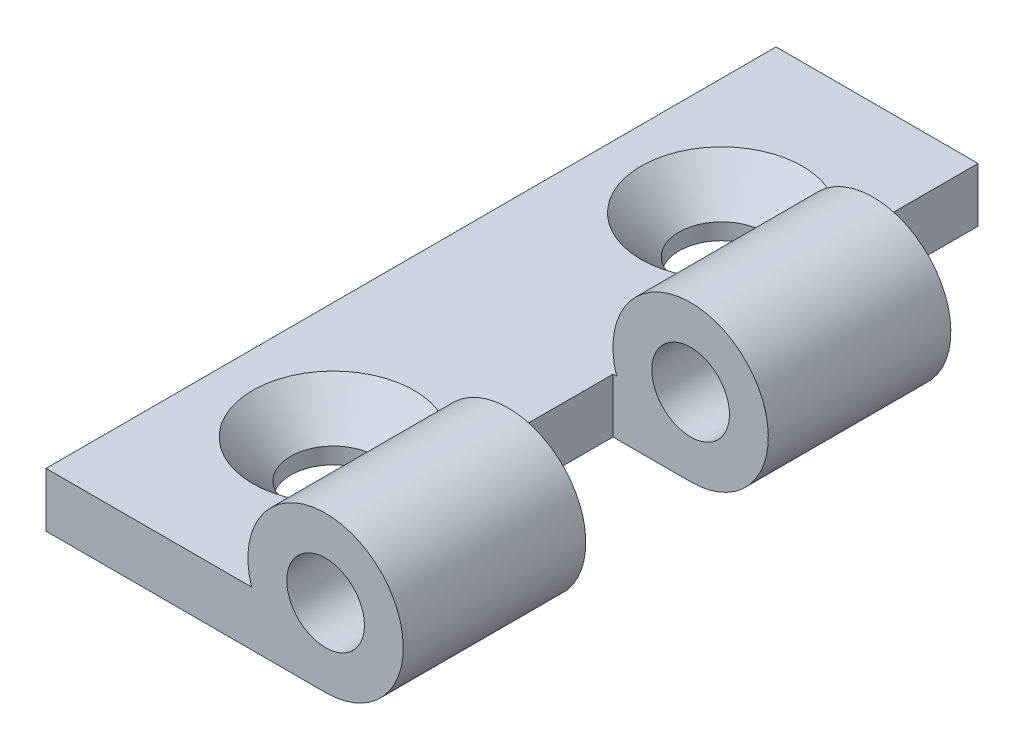
ISO-10303-21;
HEADER;
FILE_DESCRIPTION(('STEP AP214'),'2;1');
FILE_NAME('part.step','',(''),(''),'','','');
FILE_SCHEMA(('AUTOMOTIVE_DESIGN { 1 0 10303 214 1 1 1 1 }'));
ENDSEC;
DATA;
#1=APPLICATION_CONTEXT('core data for automotive mechanical design processes');
#2=APPLICATION_PROTOCOL_DEFINITION('international standard','automotive_design',2000,#1);
#3=PRODUCT_CONTEXT('',#1,'mechanical');
#4=PRODUCT('Part','Part','',(#3));
#5=PRODUCT_RELATED_PRODUCT_CATEGORY('part','',(#4));
#6=PRODUCT_DEFINITION_FORMATION('','',#4);
#7=PRODUCT_DEFINITION_CONTEXT('part definition',#1,'design');
#8=PRODUCT_DEFINITION('design','',#6,#7);
#9=PRODUCT_DEFINITION_SHAPE('','',#8);
#10=(LENGTH_UNIT() NAMED_UNIT(*) SI_UNIT(.MILLI.,.METRE.));
#11=(NAMED_UNIT(*) PLANE_ANGLE_UNIT() SI_UNIT($,.RADIAN.));
#12=(NAMED_UNIT(*) SI_UNIT($,.STERADIAN.) SOLID_ANGLE_UNIT());
#13=UNCERTAINTY_MEASURE_WITH_UNIT(LENGTH_MEASURE(1.E-05),#10,'distance_accuracy_value','');
#14=(GEOMETRIC_REPRESENTATION_CONTEXT(3) GLOBAL_UNCERTAINTY_ASSIGNED_CONTEXT((#13)) GLOBAL_UNIT_ASSIGNED_CONTEXT((#10,
#11,#12)) REPRESENTATION_CONTEXT('',''));
#15=CARTESIAN_POINT('',(0.,0.,0.));
#16=DIRECTION('',(0.,0.,1.));
#17=DIRECTION('',(1.,0.,0.));
#18=AXIS2_PLACEMENT_3D('',#15,#16,#17);
#19=CARTESIAN_POINT('',(0.,-5.,23.5));
#20=DIRECTION('',(0.,-1.,0.));
#21=DIRECTION('',(1.,0.,0.));
#22=AXIS2_PLACEMENT_3D('',#19,#20,#21);
#23=PLANE('',#22);
#24=CARTESIAN_POINT('',(-10.5,-5.,-12.5));
#25=DIRECTION('',(0.,1.,0.));
#26=DIRECTION('',(0.,0.,1.));
#27=AXIS2_PLACEMENT_3D('',#24,#25,#26);
#28=CIRCLE('',#27,2.75);
#29=CARTESIAN_POINT('',(-10.5,-5.,-9.75));
#30=VERTEX_POINT('',#29);
#31=EDGE_CURVE('E216',#30,#30,#28,.T.);
#32=ORIENTED_EDGE('',*,*,#31,.T.);
#33=EDGE_LOOP('',(#32));
#34=FACE_BOUND('',#33,.T.);
#35=CARTESIAN_POINT('',(-10.5,-5.,12.5));
#36=DIRECTION('',(0.,1.,0.));
#37=DIRECTION('',(0.,0.,1.));
#38=AXIS2_PLACEMENT_3D('',#35,#36,#37);
#39=CIRCLE('',#38,2.75);
#40=CARTESIAN_POINT('',(-10.5,-5.,15.25));
#41=VERTEX_POINT('',#40);
#42=EDGE_CURVE('E141',#41,#41,#39,.T.);
#43=ORIENTED_EDGE('',*,*,#42,.T.);
#44=EDGE_LOOP('',(#43));
#45=FACE_BOUND('',#44,.T.);
#46=DIRECTION('',(0.,0.,1.));
#47=VECTOR('',#46,1.);
#48=CARTESIAN_POINT('',(-5.,-5.,-23.5));
#49=LINE('',#48,#47);
#50=CARTESIAN_POINT('',(-5.,-5.,-23.5));
#51=VERTEX_POINT('',#50);
#52=CARTESIAN_POINT('',(-5.,-5.,-11.75));
#53=VERTEX_POINT('',#52);
#54=EDGE_CURVE('E120',#51,#53,#49,.T.);
#55=ORIENTED_EDGE('',*,*,#54,.T.);
#56=DIRECTION('',(1.,0.,0.));
#57=VECTOR('',#56,1.);
#58=CARTESIAN_POINT('',(5.,-5.,-11.75));
#59=LINE('',#58,#57);
#60=CARTESIAN_POINT('',(0.,-5.,-11.75));
#61=VERTEX_POINT('',#60);
#62=EDGE_CURVE('E127',#53,#61,#59,.T.);
#63=ORIENTED_EDGE('',*,*,#62,.T.);
#64=DIRECTION('',(0.,0.,-1.));
#65=VECTOR('',#64,1.);
#66=CARTESIAN_POINT('',(0.,-5.,23.5));
#67=LINE('',#66,#65);
#68=CARTESIAN_POINT('',(0.,-5.,0.));
#69=VERTEX_POINT('',#68);
#70=EDGE_CURVE('E168',#69,#61,#67,.T.);
#71=ORIENTED_EDGE('',*,*,#70,.F.);
#72=DIRECTION('',(-1.,0.,0.));
#73=VECTOR('',#72,1.);
#74=CARTESIAN_POINT('',(5.,-5.,0.));
#75=LINE('',#74,#73);
#76=CARTESIAN_POINT('',(-5.,-5.,0.));
#77=VERTEX_POINT('',#76);
#78=EDGE_CURVE('E130',#69,#77,#75,.T.);
#79=ORIENTED_EDGE('',*,*,#78,.T.);
#80=DIRECTION('',(0.,0.,1.));
#81=VECTOR('',#80,1.);
#82=CARTESIAN_POINT('',(-5.,-5.,0.));
#83=LINE('',#82,#81);
#84=CARTESIAN_POINT('',(-5.,-5.,11.75));
#85=VERTEX_POINT('',#84);
#86=EDGE_CURVE('E321',#77,#85,#83,.T.);
#87=ORIENTED_EDGE('',*,*,#86,.T.);
#88=DIRECTION('',(1.,0.,0.));
#89=VECTOR('',#88,1.);
#90=CARTESIAN_POINT('',(5.,-5.,11.75));
#91=LINE('',#90,#89);
#92=CARTESIAN_POINT('',(0.,-5.,11.75));
#93=VERTEX_POINT('',#92);
#94=EDGE_CURVE('E316',#85,#93,#91,.T.);
#95=ORIENTED_EDGE('',*,*,#94,.T.);
#96=CARTESIAN_POINT('',(0.,-5.,23.5));
#97=VERTEX_POINT('',#96);
#98=EDGE_CURVE('E51',#97,#93,#67,.T.);
#99=ORIENTED_EDGE('',*,*,#98,.F.);
#100=DIRECTION('',(-1.,0.,0.));
#101=VECTOR('',#100,1.);
#102=CARTESIAN_POINT('',(0.,-5.,23.5));
#103=LINE('',#102,#101);
#104=CARTESIAN_POINT('',(-18.,-5.,23.5));
#105=VERTEX_POINT('',#104);
#106=EDGE_CURVE('E157',#97,#105,#103,.T.);
#107=ORIENTED_EDGE('',*,*,#106,.T.);
#108=DIRECTION('',(0.,0.,-1.));
#109=VECTOR('',#108,1.);
#110=CARTESIAN_POINT('',(-18.,-5.,23.5));
#111=LINE('',#110,#109);
#112=CARTESIAN_POINT('',(-18.,-5.,-23.5));
#113=VERTEX_POINT('',#112);
#114=EDGE_CURVE('E137',#105,#113,#111,.T.);
#115=ORIENTED_EDGE('',*,*,#114,.T.);
#116=DIRECTION('',(-1.,0.,0.));
#117=VECTOR('',#116,1.);
#118=CARTESIAN_POINT('',(0.,-5.,-23.5));
#119=LINE('',#118,#117);
#120=EDGE_CURVE('E134',#51,#113,#119,.T.);
#121=ORIENTED_EDGE('',*,*,#120,.F.);
#122=EDGE_LOOP('',(#55,#63,#71,#79,#87,#95,#99,#107,#115,#121));
#123=FACE_BOUND('',#122,.T.);
#124=ADVANCED_FACE('F43',(#34,#45,#123),#23,.T.);
#125=CARTESIAN_POINT('',(0.,0.,23.5));
#126=DIRECTION('',(0.,0.,-1.));
#127=DIRECTION('',(-1.,0.,0.));
#128=AXIS2_PLACEMENT_3D('',#125,#126,#127);
#129=CYLINDRICAL_SURFACE('',#128,5.);
#130=CARTESIAN_POINT('',(0.,0.,11.75));
#131=DIRECTION('',(0.,0.,1.));
#132=DIRECTION('',(1.,0.,0.));
#133=AXIS2_PLACEMENT_3D('',#130,#131,#132);
#134=CIRCLE('',#133,5.);
#135=CARTESIAN_POINT('',(-4.76969600708473,-1.5,11.75));
#136=VERTEX_POINT('',#135);
#137=EDGE_CURVE('E189',#93,#136,#134,.T.);
#138=ORIENTED_EDGE('',*,*,#137,.T.);
#139=DIRECTION('',(0.,0.,-1.));
#140=VECTOR('',#139,1.);
#141=CARTESIAN_POINT('',(-4.76969600708473,-1.5,23.5));
#142=LINE('',#141,#140);
#143=CARTESIAN_POINT('',(-4.76969600708473,-1.5,23.5));
#144=VERTEX_POINT('',#143);
#145=EDGE_CURVE('E167',#144,#136,#142,.T.);
#146=ORIENTED_EDGE('',*,*,#145,.F.);
#147=CARTESIAN_POINT('',(0.,0.,23.5));
#148=DIRECTION('',(0.,0.,1.));
#149=DIRECTION('',(1.,0.,0.));
#150=AXIS2_PLACEMENT_3D('',#147,#148,#149);
#151=CIRCLE('',#150,5.);
#152=EDGE_CURVE('E226',#97,#144,#151,.T.);
#153=ORIENTED_EDGE('',*,*,#152,.F.);
#154=ORIENTED_EDGE('',*,*,#98,.T.);
#155=EDGE_LOOP('',(#138,#146,#153,#154));
#156=FACE_BOUND('',#155,.T.);
#157=ADVANCED_FACE('F266',(#156),#129,.T.);
#158=CARTESIAN_POINT('',(0.,0.,23.5));
#159=DIRECTION('',(0.,0.,-1.));
#160=DIRECTION('',(-1.,0.,0.));
#161=AXIS2_PLACEMENT_3D('',#158,#159,#160);
#162=CYLINDRICAL_SURFACE('',#161,2.5);
#163=CARTESIAN_POINT('',(0.,0.,11.75));
#164=DIRECTION('',(0.,0.,1.));
#165=DIRECTION('',(1.,0.,0.));
#166=AXIS2_PLACEMENT_3D('',#163,#164,#165);
#167=CIRCLE('',#166,2.5);
#168=CARTESIAN_POINT('',(2.5,0.,11.75));
#169=VERTEX_POINT('',#168);
#170=EDGE_CURVE('E177',#169,#169,#167,.T.);
#171=ORIENTED_EDGE('',*,*,#170,.F.);
#172=EDGE_LOOP('',(#171));
#173=FACE_BOUND('',#172,.T.);
#174=CARTESIAN_POINT('',(0.,0.,23.5));
#175=DIRECTION('',(0.,0.,1.));
#176=DIRECTION('',(1.,0.,0.));
#177=AXIS2_PLACEMENT_3D('',#174,#175,#176);
#178=CIRCLE('',#177,2.5);
#179=CARTESIAN_POINT('',(2.5,0.,23.5));
#180=VERTEX_POINT('',#179);
#181=EDGE_CURVE('E152',#180,#180,#178,.T.);
#182=ORIENTED_EDGE('',*,*,#181,.T.);
#183=EDGE_LOOP('',(#182));
#184=FACE_BOUND('',#183,.T.);
#185=ADVANCED_FACE('F249',(#173,#184),#162,.F.);
#186=CARTESIAN_POINT('',(0.,0.,-23.5));
#187=DIRECTION('',(0.,0.,1.));
#188=DIRECTION('',(1.,0.,0.));
#189=AXIS2_PLACEMENT_3D('',#186,#187,#188);
#190=PLANE('',#189);
#191=DIRECTION('',(0.,1.,0.));
#192=VECTOR('',#191,1.);
#193=CARTESIAN_POINT('',(-5.,-5.,-23.5));
#194=LINE('',#193,#192);
#195=CARTESIAN_POINT('',(-5.,-1.5,-23.5));
#196=VERTEX_POINT('',#195);
#197=EDGE_CURVE('E69',#51,#196,#194,.T.);
#198=ORIENTED_EDGE('',*,*,#197,.F.);
#199=ORIENTED_EDGE('',*,*,#120,.T.);
#200=DIRECTION('',(0.,1.,0.));
#201=VECTOR('',#200,1.);
#202=CARTESIAN_POINT('',(-18.,0.,-23.5));
#203=LINE('',#202,#201);
#204=CARTESIAN_POINT('',(-18.,-1.5,-23.5));
#205=VERTEX_POINT('',#204);
#206=EDGE_CURVE('E146',#113,#205,#203,.T.);
#207=ORIENTED_EDGE('',*,*,#206,.T.);
#208=DIRECTION('',(1.,0.,0.));
#209=VECTOR('',#208,1.);
#210=CARTESIAN_POINT('',(0.,-1.5,-23.5));
#211=LINE('',#210,#209);
#212=EDGE_CURVE('E139',#205,#196,#211,.T.);
#213=ORIENTED_EDGE('',*,*,#212,.T.);
#214=EDGE_LOOP('',(#198,#199,#207,#213));
#215=FACE_BOUND('',#214,.T.);
#216=ADVANCED_FACE('F132',(#215),#190,.F.);
#217=CARTESIAN_POINT('',(0.,0.,-11.75));
#218=DIRECTION('',(0.,0.,1.));
#219=DIRECTION('',(1.,0.,0.));
#220=AXIS2_PLACEMENT_3D('',#217,#218,#219);
#221=CIRCLE('',#220,5.);
#222=CARTESIAN_POINT('',(-4.76969600708473,-1.5,-11.75));
#223=VERTEX_POINT('',#222);
#224=EDGE_CURVE('E192',#61,#223,#221,.T.);
#225=ORIENTED_EDGE('',*,*,#224,.T.);
#226=CARTESIAN_POINT('',(-4.76969600708473,-1.5,0.));
#227=VERTEX_POINT('',#226);
#228=EDGE_CURVE('E164',#227,#223,#142,.T.);
#229=ORIENTED_EDGE('',*,*,#228,.F.);
#230=CARTESIAN_POINT('',(0.,0.,0.));
#231=DIRECTION('',(0.,0.,-1.));
#232=DIRECTION('',(-1.,0.,0.));
#233=AXIS2_PLACEMENT_3D('',#230,#231,#232);
#234=CIRCLE('',#233,5.);
#235=EDGE_CURVE('E59',#227,#69,#234,.T.);
#236=ORIENTED_EDGE('',*,*,#235,.T.);
#237=ORIENTED_EDGE('',*,*,#70,.T.);
#238=EDGE_LOOP('',(#225,#229,#236,#237));
#239=FACE_BOUND('',#238,.T.);
#240=ADVANCED_FACE('F275',(#239),#129,.T.);
#241=CARTESIAN_POINT('',(0.,-1.5,23.5));
#242=DIRECTION('',(0.,1.,0.));
#243=DIRECTION('',(0.,0.,1.));
#244=AXIS2_PLACEMENT_3D('',#241,#242,#243);
#245=PLANE('',#244);
#246=DIRECTION('',(1.,0.,0.));
#247=VECTOR('',#246,1.);
#248=CARTESIAN_POINT('',(0.,-1.5,-11.75));
#249=LINE('',#248,#247);
#250=CARTESIAN_POINT('',(-5.,-1.5,-11.75));
#251=VERTEX_POINT('',#250);
#252=EDGE_CURVE('E190',#251,#223,#249,.T.);
#253=ORIENTED_EDGE('',*,*,#252,.F.);
#254=DIRECTION('',(0.,0.,1.));
#255=VECTOR('',#254,1.);
#256=CARTESIAN_POINT('',(-5.,-1.5,23.5));
#257=LINE('',#256,#255);
#258=EDGE_CURVE('E178',#196,#251,#257,.T.);
#259=ORIENTED_EDGE('',*,*,#258,.F.);
#260=ORIENTED_EDGE('',*,*,#212,.F.);
#261=DIRECTION('',(0.,0.,-1.));
#262=VECTOR('',#261,1.);
#263=CARTESIAN_POINT('',(-18.,-1.5,23.5));
#264=LINE('',#263,#262);
#265=CARTESIAN_POINT('',(-18.,-1.5,23.5));
#266=VERTEX_POINT('',#265);
#267=EDGE_CURVE('E165',#266,#205,#264,.T.);
#268=ORIENTED_EDGE('',*,*,#267,.F.);
#269=DIRECTION('',(1.,0.,0.));
#270=VECTOR('',#269,1.);
#271=CARTESIAN_POINT('',(0.,-1.5,23.5));
#272=LINE('',#271,#270);
#273=EDGE_CURVE('E231',#266,#144,#272,.T.);
#274=ORIENTED_EDGE('',*,*,#273,.T.);
#275=ORIENTED_EDGE('',*,*,#145,.T.);
#276=DIRECTION('',(1.,0.,0.));
#277=VECTOR('',#276,1.);
#278=CARTESIAN_POINT('',(0.,-1.5,11.75));
#279=LINE('',#278,#277);
#280=CARTESIAN_POINT('',(-5.,-1.5,11.75));
#281=VERTEX_POINT('',#280);
#282=EDGE_CURVE('E181',#281,#136,#279,.T.);
#283=ORIENTED_EDGE('',*,*,#282,.F.);
#284=DIRECTION('',(0.,0.,1.));
#285=VECTOR('',#284,1.);
#286=CARTESIAN_POINT('',(-5.,-1.5,23.5));
#287=LINE('',#286,#285);
#288=CARTESIAN_POINT('',(-5.,-1.5,0.));
#289=VERTEX_POINT('',#288);
#290=EDGE_CURVE('E11',#289,#281,#287,.T.);
#291=ORIENTED_EDGE('',*,*,#290,.F.);
#292=DIRECTION('',(-1.,0.,0.));
#293=VECTOR('',#292,1.);
#294=CARTESIAN_POINT('',(0.,-1.5,0.));
#295=LINE('',#294,#293);
#296=EDGE_CURVE('E180',#227,#289,#295,.T.);
#297=ORIENTED_EDGE('',*,*,#296,.F.);
#298=ORIENTED_EDGE('',*,*,#228,.T.);
#299=EDGE_LOOP('',(#253,#259,#260,#268,#274,#275,#283,#291,#297,#298));
#300=FACE_BOUND('',#299,.T.);
#301=CARTESIAN_POINT('',(-10.5,-1.5,-12.5));
#302=DIRECTION('',(0.,1.,0.));
#303=DIRECTION('',(0.,0.,1.));
#304=AXIS2_PLACEMENT_3D('',#301,#302,#303);
#305=CIRCLE('',#304,5.2);
#306=CARTESIAN_POINT('',(-10.5,-1.5,-7.3));
#307=VERTEX_POINT('',#306);
#308=EDGE_CURVE('E208',#307,#307,#305,.T.);
#309=ORIENTED_EDGE('',*,*,#308,.F.);
#310=EDGE_LOOP('',(#309));
#311=FACE_BOUND('',#310,.T.);
#312=CARTESIAN_POINT('',(-10.5,-1.5,12.5));
#313=DIRECTION('',(0.,1.,0.));
#314=DIRECTION('',(0.,0.,1.));
#315=AXIS2_PLACEMENT_3D('',#312,#313,#314);
#316=CIRCLE('',#315,5.2);
#317=CARTESIAN_POINT('',(-10.5,-1.5,17.7));
#318=VERTEX_POINT('',#317);
#319=EDGE_CURVE('E219',#318,#318,#316,.T.);
#320=ORIENTED_EDGE('',*,*,#319,.F.);
#321=EDGE_LOOP('',(#320));
#322=FACE_BOUND('',#321,.T.);
#323=ADVANCED_FACE('F261',(#300,#311,#322),#245,.T.);
#324=CARTESIAN_POINT('',(-18.,0.,23.5));
#325=DIRECTION('',(-1.,0.,0.));
#326=DIRECTION('',(0.,0.,1.));
#327=AXIS2_PLACEMENT_3D('',#324,#325,#326);
#328=PLANE('',#327);
#329=ORIENTED_EDGE('',*,*,#206,.F.);
#330=ORIENTED_EDGE('',*,*,#114,.F.);
#331=DIRECTION('',(0.,1.,0.));
#332=VECTOR('',#331,1.);
#333=CARTESIAN_POINT('',(-18.,0.,23.5));
#334=LINE('',#333,#332);
#335=EDGE_CURVE('E232',#105,#266,#334,.T.);
#336=ORIENTED_EDGE('',*,*,#335,.T.);
#337=ORIENTED_EDGE('',*,*,#267,.T.);
#338=EDGE_LOOP('',(#329,#330,#336,#337));
#339=FACE_BOUND('',#338,.T.);
#340=ADVANCED_FACE('F253',(#339),#328,.T.);
#341=CARTESIAN_POINT('',(0.,0.,23.5));
#342=DIRECTION('',(0.,0.,1.));
#343=DIRECTION('',(1.,0.,0.));
#344=AXIS2_PLACEMENT_3D('',#341,#342,#343);
#345=PLANE('',#344);
#346=ORIENTED_EDGE('',*,*,#106,.F.);
#347=ORIENTED_EDGE('',*,*,#152,.T.);
#348=ORIENTED_EDGE('',*,*,#273,.F.);
#349=ORIENTED_EDGE('',*,*,#335,.F.);
#350=EDGE_LOOP('',(#346,#347,#348,#349));
#351=FACE_BOUND('',#350,.T.);
#352=ORIENTED_EDGE('',*,*,#181,.F.);
#353=EDGE_LOOP('',(#352));
#354=FACE_BOUND('',#353,.T.);
#355=ADVANCED_FACE('F250',(#351,#354),#345,.T.);
#356=CARTESIAN_POINT('',(-10.5,-1.5,12.5));
#357=DIRECTION('',(0.,1.,0.));
#358=DIRECTION('',(0.,0.,1.));
#359=AXIS2_PLACEMENT_3D('',#356,#357,#358);
#360=CYLINDRICAL_SURFACE('',#359,2.75);
#361=ORIENTED_EDGE('',*,*,#42,.F.);
#362=EDGE_LOOP('',(#361));
#363=FACE_BOUND('',#362,.T.);
#364=CARTESIAN_POINT('',(-10.5,-3.95,12.5));
#365=DIRECTION('',(0.,1.,0.));
#366=DIRECTION('',(0.,0.,1.));
#367=AXIS2_PLACEMENT_3D('',#364,#365,#366);
#368=CIRCLE('',#367,2.75);
#369=CARTESIAN_POINT('',(-10.5,-3.95,15.25));
#370=VERTEX_POINT('',#369);
#371=EDGE_CURVE('E151',#370,#370,#368,.T.);
#372=ORIENTED_EDGE('',*,*,#371,.T.);
#373=EDGE_LOOP('',(#372));
#374=FACE_BOUND('',#373,.T.);
#375=ADVANCED_FACE('F247',(#363,#374),#360,.F.);
#376=CARTESIAN_POINT('',(-10.5,-1.5,12.5));
#377=DIRECTION('',(0.,1.,0.));
#378=DIRECTION('',(0.,0.,1.));
#379=AXIS2_PLACEMENT_3D('',#376,#377,#378);
#380=CONICAL_SURFACE('',#379,5.2,0.785398163397449);
#381=ORIENTED_EDGE('',*,*,#371,.F.);
#382=EDGE_LOOP('',(#381));
#383=FACE_BOUND('',#382,.T.);
#384=ORIENTED_EDGE('',*,*,#319,.T.);
#385=EDGE_LOOP('',(#384));
#386=FACE_BOUND('',#385,.T.);
#387=ADVANCED_FACE('F256',(#383,#386),#380,.F.);
#388=CARTESIAN_POINT('',(-10.5,-1.5,-12.5));
#389=DIRECTION('',(0.,1.,0.));
#390=DIRECTION('',(0.,0.,1.));
#391=AXIS2_PLACEMENT_3D('',#388,#389,#390);
#392=CYLINDRICAL_SURFACE('',#391,2.75);
#393=ORIENTED_EDGE('',*,*,#31,.F.);
#394=EDGE_LOOP('',(#393));
#395=FACE_BOUND('',#394,.T.);
#396=CARTESIAN_POINT('',(-10.5,-3.95,-12.5));
#397=DIRECTION('',(0.,1.,0.));
#398=DIRECTION('',(0.,0.,1.));
#399=AXIS2_PLACEMENT_3D('',#396,#397,#398);
#400=CIRCLE('',#399,2.75);
#401=CARTESIAN_POINT('',(-10.5,-3.95,-9.75));
#402=VERTEX_POINT('',#401);
#403=EDGE_CURVE('E215',#402,#402,#400,.T.);
#404=ORIENTED_EDGE('',*,*,#403,.T.);
#405=EDGE_LOOP('',(#404));
#406=FACE_BOUND('',#405,.T.);
#407=ADVANCED_FACE('F282',(#395,#406),#392,.F.);
#408=CARTESIAN_POINT('',(-10.5,-1.5,-12.5));
#409=DIRECTION('',(0.,1.,0.));
#410=DIRECTION('',(0.,0.,1.));
#411=AXIS2_PLACEMENT_3D('',#408,#409,#410);
#412=CONICAL_SURFACE('',#411,5.2,0.785398163397449);
#413=ORIENTED_EDGE('',*,*,#403,.F.);
#414=EDGE_LOOP('',(#413));
#415=FACE_BOUND('',#414,.T.);
#416=ORIENTED_EDGE('',*,*,#308,.T.);
#417=EDGE_LOOP('',(#416));
#418=FACE_BOUND('',#417,.T.);
#419=ADVANCED_FACE('F313',(#415,#418),#412,.F.);
#420=CARTESIAN_POINT('',(5.,-5.,11.75));
#421=DIRECTION('',(0.,0.,1.));
#422=DIRECTION('',(1.,0.,0.));
#423=AXIS2_PLACEMENT_3D('',#420,#421,#422);
#424=PLANE('',#423);
#425=ORIENTED_EDGE('',*,*,#170,.T.);
#426=EDGE_LOOP('',(#425));
#427=FACE_BOUND('',#426,.T.);
#428=ORIENTED_EDGE('',*,*,#94,.F.);
#429=DIRECTION('',(0.,1.,0.));
#430=VECTOR('',#429,1.);
#431=CARTESIAN_POINT('',(-5.,-5.,11.75));
#432=LINE('',#431,#430);
#433=EDGE_CURVE('E318',#85,#281,#432,.T.);
#434=ORIENTED_EDGE('',*,*,#433,.T.);
#435=ORIENTED_EDGE('',*,*,#282,.T.);
#436=ORIENTED_EDGE('',*,*,#137,.F.);
#437=EDGE_LOOP('',(#428,#434,#435,#436));
#438=FACE_BOUND('',#437,.T.);
#439=ADVANCED_FACE('F306',(#427,#438),#424,.F.);
#440=CARTESIAN_POINT('',(5.,-5.,0.));
#441=DIRECTION('',(0.,0.,-1.));
#442=DIRECTION('',(-1.,0.,0.));
#443=AXIS2_PLACEMENT_3D('',#440,#441,#442);
#444=PLANE('',#443);
#445=CARTESIAN_POINT('',(0.,0.,0.));
#446=DIRECTION('',(0.,0.,-1.));
#447=DIRECTION('',(-1.,0.,0.));
#448=AXIS2_PLACEMENT_3D('',#445,#446,#447);
#449=CIRCLE('',#448,2.5);
#450=CARTESIAN_POINT('',(-2.5,0.,0.));
#451=VERTEX_POINT('',#450);
#452=EDGE_CURVE('E171',#451,#451,#449,.T.);
#453=ORIENTED_EDGE('',*,*,#452,.T.);
#454=EDGE_LOOP('',(#453));
#455=FACE_BOUND('',#454,.T.);
#456=ORIENTED_EDGE('',*,*,#235,.F.);
#457=ORIENTED_EDGE('',*,*,#296,.T.);
#458=DIRECTION('',(0.,1.,0.));
#459=VECTOR('',#458,1.);
#460=CARTESIAN_POINT('',(-5.,-5.,0.));
#461=LINE('',#460,#459);
#462=EDGE_CURVE('E325',#77,#289,#461,.T.);
#463=ORIENTED_EDGE('',*,*,#462,.F.);
#464=ORIENTED_EDGE('',*,*,#78,.F.);
#465=EDGE_LOOP('',(#456,#457,#463,#464));
#466=FACE_BOUND('',#465,.T.);
#467=ADVANCED_FACE('F309',(#455,#466),#444,.F.);
#468=CARTESIAN_POINT('',(-5.,-5.,0.));
#469=DIRECTION('',(-1.,0.,0.));
#470=DIRECTION('',(0.,0.,1.));
#471=AXIS2_PLACEMENT_3D('',#468,#469,#470);
#472=PLANE('',#471);
#473=ORIENTED_EDGE('',*,*,#290,.T.);
#474=ORIENTED_EDGE('',*,*,#433,.F.);
#475=ORIENTED_EDGE('',*,*,#86,.F.);
#476=ORIENTED_EDGE('',*,*,#462,.T.);
#477=EDGE_LOOP('',(#473,#474,#475,#476));
#478=FACE_BOUND('',#477,.T.);
#479=ADVANCED_FACE('F354',(#478),#472,.F.);
#480=CARTESIAN_POINT('',(5.,-5.,-11.75));
#481=DIRECTION('',(0.,0.,1.));
#482=DIRECTION('',(1.,0.,0.));
#483=AXIS2_PLACEMENT_3D('',#480,#481,#482);
#484=PLANE('',#483);
#485=CARTESIAN_POINT('',(0.,0.,-11.75));
#486=DIRECTION('',(0.,0.,1.));
#487=DIRECTION('',(1.,0.,0.));
#488=AXIS2_PLACEMENT_3D('',#485,#486,#487);
#489=CIRCLE('',#488,2.5);
#490=CARTESIAN_POINT('',(2.5,0.,-11.75));
#491=VERTEX_POINT('',#490);
#492=EDGE_CURVE('E184',#491,#491,#489,.T.);
#493=ORIENTED_EDGE('',*,*,#492,.T.);
#494=EDGE_LOOP('',(#493));
#495=FACE_BOUND('',#494,.T.);
#496=ORIENTED_EDGE('',*,*,#62,.F.);
#497=DIRECTION('',(0.,1.,0.));
#498=VECTOR('',#497,1.);
#499=CARTESIAN_POINT('',(-5.,-5.,-11.75));
#500=LINE('',#499,#498);
#501=EDGE_CURVE('E118',#53,#251,#500,.T.);
#502=ORIENTED_EDGE('',*,*,#501,.T.);
#503=ORIENTED_EDGE('',*,*,#252,.T.);
#504=ORIENTED_EDGE('',*,*,#224,.F.);
#505=EDGE_LOOP('',(#496,#502,#503,#504));
#506=FACE_BOUND('',#505,.T.);
#507=ADVANCED_FACE('F371',(#495,#506),#484,.F.);
#508=CARTESIAN_POINT('',(-5.,-5.,-23.5));
#509=DIRECTION('',(-1.,0.,0.));
#510=DIRECTION('',(0.,0.,1.));
#511=AXIS2_PLACEMENT_3D('',#508,#509,#510);
#512=PLANE('',#511);
#513=ORIENTED_EDGE('',*,*,#258,.T.);
#514=ORIENTED_EDGE('',*,*,#501,.F.);
#515=ORIENTED_EDGE('',*,*,#54,.F.);
#516=ORIENTED_EDGE('',*,*,#197,.T.);
#517=EDGE_LOOP('',(#513,#514,#515,#516));
#518=FACE_BOUND('',#517,.T.);
#519=ADVANCED_FACE('F119',(#518),#512,.F.);
#520=ORIENTED_EDGE('',*,*,#492,.F.);
#521=EDGE_LOOP('',(#520));
#522=FACE_BOUND('',#521,.T.);
#523=ORIENTED_EDGE('',*,*,#452,.F.);
#524=EDGE_LOOP('',(#523));
#525=FACE_BOUND('',#524,.T.);
#526=ADVANCED_FACE('F297',(#522,#525),#162,.F.);
#527=CLOSED_SHELL('',(#124,#157,#185,#216,#240,#323,#340,#355,#375,#387,#407,#419,#439,#467,
#479,#507,#519,#526));
#528=MANIFOLD_SOLID_BREP('B2',#527);
#529=ADVANCED_BREP_SHAPE_REPRESENTATION('',(#18,#528),#14);
#530=SHAPE_DEFINITION_REPRESENTATION(#9,#529);
ENDSEC;
END-ISO-10303-21;
